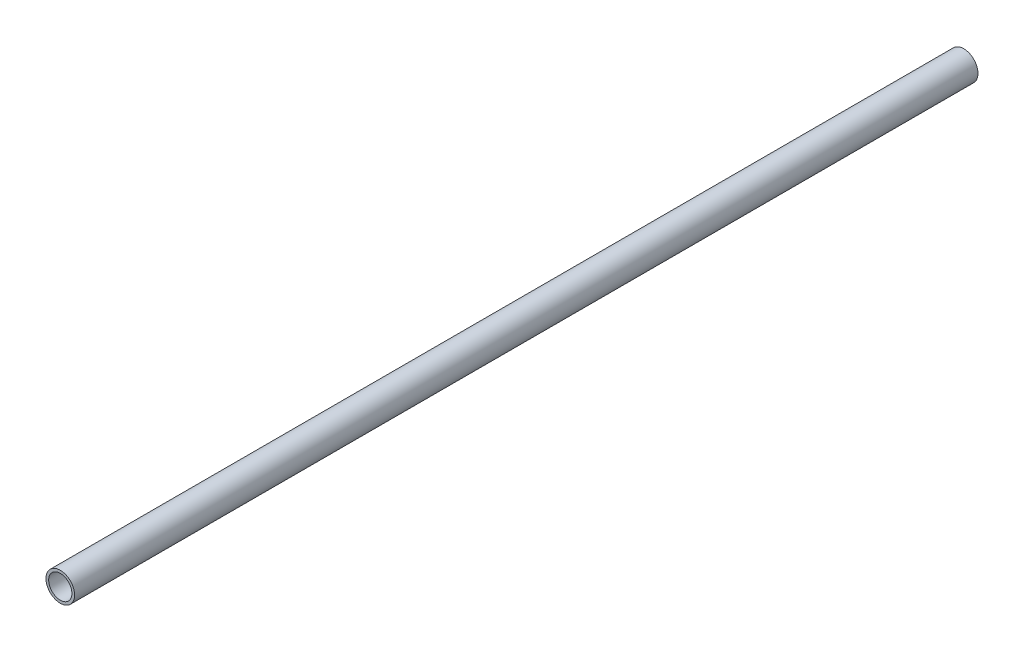
ISO-10303-21;
HEADER;
FILE_DESCRIPTION(('STEP AP214'),'2;1');
FILE_NAME('part.step','',(''),(''),'','','');
FILE_SCHEMA(('AUTOMOTIVE_DESIGN { 1 0 10303 214 1 1 1 1 }'));
ENDSEC;
DATA;
#1=APPLICATION_CONTEXT('core data for automotive mechanical design processes');
#2=APPLICATION_PROTOCOL_DEFINITION('international standard','automotive_design',2000,#1);
#3=PRODUCT_CONTEXT('',#1,'mechanical');
#4=PRODUCT('Part','Part','',(#3));
#5=PRODUCT_RELATED_PRODUCT_CATEGORY('part','',(#4));
#6=PRODUCT_DEFINITION_FORMATION('','',#4);
#7=PRODUCT_DEFINITION_CONTEXT('part definition',#1,'design');
#8=PRODUCT_DEFINITION('design','',#6,#7);
#9=PRODUCT_DEFINITION_SHAPE('','',#8);
#10=(LENGTH_UNIT() NAMED_UNIT(*) SI_UNIT(.MILLI.,.METRE.));
#11=(NAMED_UNIT(*) PLANE_ANGLE_UNIT() SI_UNIT($,.RADIAN.));
#12=(NAMED_UNIT(*) SI_UNIT($,.STERADIAN.) SOLID_ANGLE_UNIT());
#13=UNCERTAINTY_MEASURE_WITH_UNIT(LENGTH_MEASURE(1.E-05),#10,'distance_accuracy_value','');
#14=(GEOMETRIC_REPRESENTATION_CONTEXT(3) GLOBAL_UNCERTAINTY_ASSIGNED_CONTEXT((#13)) GLOBAL_UNIT_ASSIGNED_CONTEXT((#10,
#11,#12)) REPRESENTATION_CONTEXT('',''));
#15=CARTESIAN_POINT('',(0.,0.,0.));
#16=DIRECTION('',(0.,0.,1.));
#17=DIRECTION('',(1.,0.,0.));
#18=AXIS2_PLACEMENT_3D('',#15,#16,#17);
#19=CARTESIAN_POINT('',(0.,0.,505.));
#20=DIRECTION('',(0.,0.,-1.));
#21=DIRECTION('',(-1.,0.,0.));
#22=AXIS2_PLACEMENT_3D('',#19,#20,#21);
#23=CYLINDRICAL_SURFACE('',#22,16.);
#24=CARTESIAN_POINT('',(0.,0.,505.));
#25=DIRECTION('',(0.,0.,1.));
#26=DIRECTION('',(1.,0.,0.));
#27=AXIS2_PLACEMENT_3D('',#24,#25,#26);
#28=CIRCLE('',#27,16.);
#29=CARTESIAN_POINT('',(16.,0.,505.));
#30=VERTEX_POINT('',#29);
#31=EDGE_CURVE('E10',#30,#30,#28,.T.);
#32=ORIENTED_EDGE('',*,*,#31,.F.);
#33=EDGE_LOOP('',(#32));
#34=FACE_BOUND('',#33,.T.);
#35=CARTESIAN_POINT('',(0.,0.,-505.));
#36=DIRECTION('',(0.,0.,1.));
#37=DIRECTION('',(1.,0.,0.));
#38=AXIS2_PLACEMENT_3D('',#35,#36,#37);
#39=CIRCLE('',#38,16.);
#40=CARTESIAN_POINT('',(16.,0.,-505.));
#41=VERTEX_POINT('',#40);
#42=EDGE_CURVE('E35',#41,#41,#39,.T.);
#43=ORIENTED_EDGE('',*,*,#42,.T.);
#44=EDGE_LOOP('',(#43));
#45=FACE_BOUND('',#44,.T.);
#46=ADVANCED_FACE('F32',(#34,#45),#23,.T.);
#47=CARTESIAN_POINT('',(0.,0.,505.));
#48=DIRECTION('',(0.,0.,1.));
#49=DIRECTION('',(1.,0.,0.));
#50=AXIS2_PLACEMENT_3D('',#47,#48,#49);
#51=PLANE('',#50);
#52=CARTESIAN_POINT('',(0.,0.,505.));
#53=DIRECTION('',(0.,0.,1.));
#54=DIRECTION('',(1.,0.,0.));
#55=AXIS2_PLACEMENT_3D('',#52,#53,#54);
#56=CIRCLE('',#55,13.);
#57=CARTESIAN_POINT('',(13.,0.,505.));
#58=VERTEX_POINT('',#57);
#59=EDGE_CURVE('E42',#58,#58,#56,.T.);
#60=ORIENTED_EDGE('',*,*,#59,.F.);
#61=EDGE_LOOP('',(#60));
#62=FACE_BOUND('',#61,.T.);
#63=ORIENTED_EDGE('',*,*,#31,.T.);
#64=EDGE_LOOP('',(#63));
#65=FACE_BOUND('',#64,.T.);
#66=ADVANCED_FACE('F53',(#62,#65),#51,.T.);
#67=CARTESIAN_POINT('',(0.,0.,-505.));
#68=DIRECTION('',(0.,0.,1.));
#69=DIRECTION('',(1.,0.,0.));
#70=AXIS2_PLACEMENT_3D('',#67,#68,#69);
#71=PLANE('',#70);
#72=CARTESIAN_POINT('',(0.,0.,-505.));
#73=DIRECTION('',(0.,0.,1.));
#74=DIRECTION('',(1.,0.,0.));
#75=AXIS2_PLACEMENT_3D('',#72,#73,#74);
#76=CIRCLE('',#75,13.);
#77=CARTESIAN_POINT('',(13.,0.,-505.));
#78=VERTEX_POINT('',#77);
#79=EDGE_CURVE('E44',#78,#78,#76,.T.);
#80=ORIENTED_EDGE('',*,*,#79,.T.);
#81=EDGE_LOOP('',(#80));
#82=FACE_BOUND('',#81,.T.);
#83=ORIENTED_EDGE('',*,*,#42,.F.);
#84=EDGE_LOOP('',(#83));
#85=FACE_BOUND('',#84,.T.);
#86=ADVANCED_FACE('F55',(#82,#85),#71,.F.);
#87=CARTESIAN_POINT('',(0.,0.,505.));
#88=DIRECTION('',(0.,0.,-1.));
#89=DIRECTION('',(-1.,0.,0.));
#90=AXIS2_PLACEMENT_3D('',#87,#88,#89);
#91=CYLINDRICAL_SURFACE('',#90,13.);
#92=ORIENTED_EDGE('',*,*,#59,.T.);
#93=EDGE_LOOP('',(#92));
#94=FACE_BOUND('',#93,.T.);
#95=ORIENTED_EDGE('',*,*,#79,.F.);
#96=EDGE_LOOP('',(#95));
#97=FACE_BOUND('',#96,.T.);
#98=ADVANCED_FACE('F50',(#94,#97),#91,.F.);
#99=CLOSED_SHELL('',(#46,#66,#86,#98));
#100=MANIFOLD_SOLID_BREP('B2',#99);
#101=ADVANCED_BREP_SHAPE_REPRESENTATION('',(#18,#100),#14);
#102=SHAPE_DEFINITION_REPRESENTATION(#9,#101);
ENDSEC;
END-ISO-10303-21;
